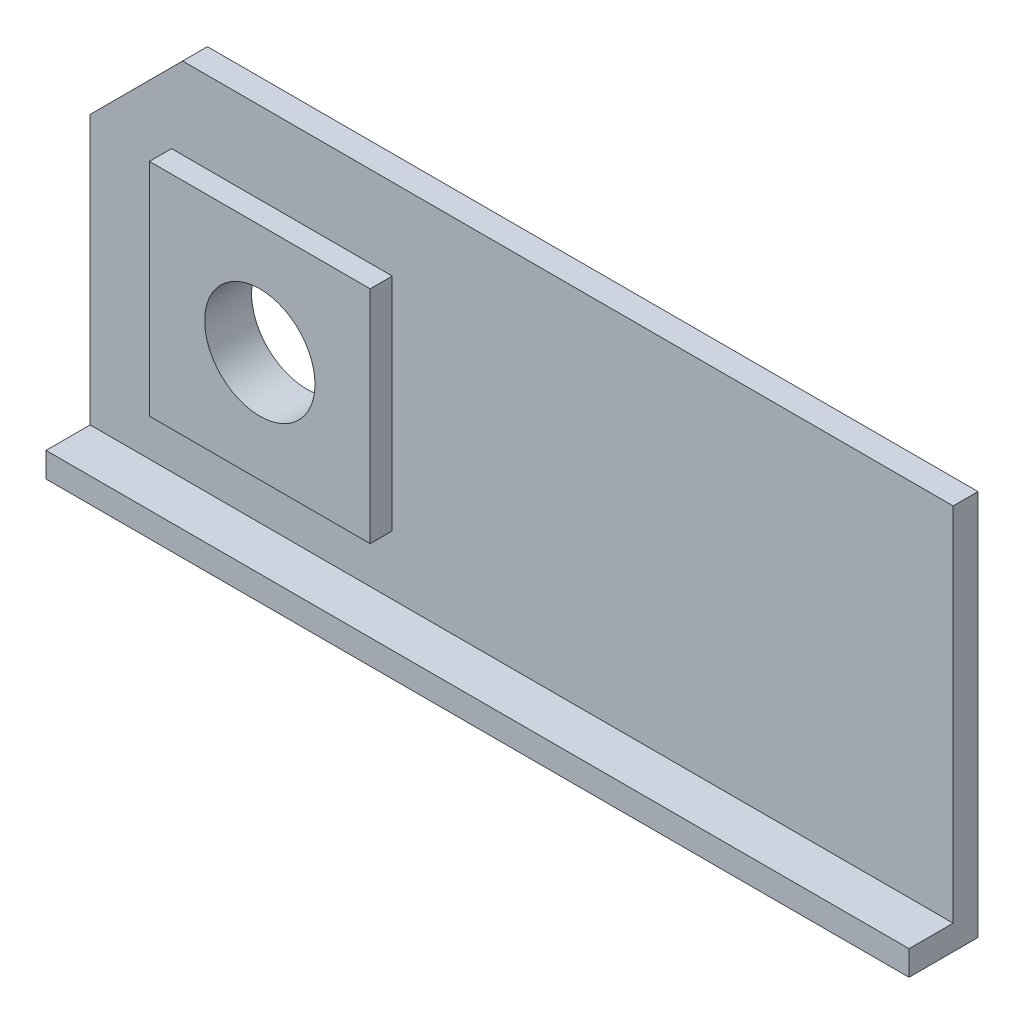
ISO-10303-21;
HEADER;
FILE_DESCRIPTION(('STEP AP214'),'2;1');
FILE_NAME('part.step','',(''),(''),'','','');
FILE_SCHEMA(('AUTOMOTIVE_DESIGN { 1 0 10303 214 1 1 1 1 }'));
ENDSEC;
DATA;
#1=APPLICATION_CONTEXT('core data for automotive mechanical design processes');
#2=APPLICATION_PROTOCOL_DEFINITION('international standard','automotive_design',2000,#1);
#3=PRODUCT_CONTEXT('',#1,'mechanical');
#4=PRODUCT('Part','Part','',(#3));
#5=PRODUCT_RELATED_PRODUCT_CATEGORY('part','',(#4));
#6=PRODUCT_DEFINITION_FORMATION('','',#4);
#7=PRODUCT_DEFINITION_CONTEXT('part definition',#1,'design');
#8=PRODUCT_DEFINITION('design','',#6,#7);
#9=PRODUCT_DEFINITION_SHAPE('','',#8);
#10=(LENGTH_UNIT() NAMED_UNIT(*) SI_UNIT(.MILLI.,.METRE.));
#11=(NAMED_UNIT(*) PLANE_ANGLE_UNIT() SI_UNIT($,.RADIAN.));
#12=(NAMED_UNIT(*) SI_UNIT($,.STERADIAN.) SOLID_ANGLE_UNIT());
#13=UNCERTAINTY_MEASURE_WITH_UNIT(LENGTH_MEASURE(1.E-05),#10,'distance_accuracy_value','');
#14=(GEOMETRIC_REPRESENTATION_CONTEXT(3) GLOBAL_UNCERTAINTY_ASSIGNED_CONTEXT((#13)) GLOBAL_UNIT_ASSIGNED_CONTEXT((#10,
#11,#12)) REPRESENTATION_CONTEXT('',''));
#15=CARTESIAN_POINT('',(0.,0.,0.));
#16=DIRECTION('',(0.,0.,1.));
#17=DIRECTION('',(1.,0.,0.));
#18=AXIS2_PLACEMENT_3D('',#15,#16,#17);
#19=CARTESIAN_POINT('',(0.,0.,4.5));
#20=DIRECTION('',(0.,0.,1.));
#21=DIRECTION('',(1.,0.,0.));
#22=AXIS2_PLACEMENT_3D('',#19,#20,#21);
#23=PLANE('',#22);
#24=DIRECTION('',(-1.,0.,0.));
#25=VECTOR('',#24,1.);
#26=CARTESIAN_POINT('',(0.,-28.8754339476876,4.5));
#27=LINE('',#26,#25);
#28=CARTESIAN_POINT('',(-6.75864695548756,-28.8754339476876,4.5));
#29=VERTEX_POINT('',#28);
#30=CARTESIAN_POINT('',(-163.18445936999,-28.8754339476876,4.5));
#31=VERTEX_POINT('',#30);
#32=EDGE_CURVE('E87',#29,#31,#27,.T.);
#33=ORIENTED_EDGE('',*,*,#32,.F.);
#34=DIRECTION('',(0.,1.,0.));
#35=VECTOR('',#34,1.);
#36=CARTESIAN_POINT('',(-6.75864695548756,0.,4.5));
#37=LINE('',#36,#35);
#38=CARTESIAN_POINT('',(-6.75864695548756,36.6245660523124,4.5));
#39=VERTEX_POINT('',#38);
#40=EDGE_CURVE('E113',#29,#39,#37,.T.);
#41=ORIENTED_EDGE('',*,*,#40,.T.);
#42=DIRECTION('',(-1.,0.,0.));
#43=VECTOR('',#42,1.);
#44=CARTESIAN_POINT('',(0.,36.6245660523124,4.5));
#45=LINE('',#44,#43);
#46=CARTESIAN_POINT('',(-146.427679381491,36.6245660523124,4.5));
#47=VERTEX_POINT('',#46);
#48=EDGE_CURVE('E106',#39,#47,#45,.T.);
#49=ORIENTED_EDGE('',*,*,#48,.T.);
#50=DIRECTION('',(-0.707106781186546,-0.707106781186549,0.));
#51=VECTOR('',#50,1.);
#52=CARTESIAN_POINT('',(-91.5261227169018,91.5261227169015,4.5));
#53=LINE('',#52,#51);
#54=CARTESIAN_POINT('',(-163.18445936999,19.8677860638126,4.5));
#55=VERTEX_POINT('',#54);
#56=EDGE_CURVE('E104',#47,#55,#53,.T.);
#57=ORIENTED_EDGE('',*,*,#56,.T.);
#58=DIRECTION('',(0.,-1.,0.));
#59=VECTOR('',#58,1.);
#60=CARTESIAN_POINT('',(-163.18445936999,0.,4.5));
#61=LINE('',#60,#59);
#62=EDGE_CURVE('E62',#55,#31,#61,.T.);
#63=ORIENTED_EDGE('',*,*,#62,.T.);
#64=EDGE_LOOP('',(#33,#41,#49,#57,#63));
#65=FACE_BOUND('',#64,.T.);
#66=DIRECTION('',(0.,1.,0.));
#67=VECTOR('',#66,1.);
#68=CARTESIAN_POINT('',(-108.427679381491,21.8677860638127,4.5));
#69=LINE('',#68,#67);
#70=CARTESIAN_POINT('',(-108.427679381491,-18.1322139361873,4.5));
#71=VERTEX_POINT('',#70);
#72=CARTESIAN_POINT('',(-108.427679381491,21.8677860638127,4.5));
#73=VERTEX_POINT('',#72);
#74=EDGE_CURVE('E158',#71,#73,#69,.T.);
#75=ORIENTED_EDGE('',*,*,#74,.F.);
#76=DIRECTION('',(1.,0.,0.));
#77=VECTOR('',#76,1.);
#78=CARTESIAN_POINT('',(-108.427679381491,-18.1322139361873,4.5));
#79=LINE('',#78,#77);
#80=CARTESIAN_POINT('',(-148.427679381491,-18.1322139361873,4.5));
#81=VERTEX_POINT('',#80);
#82=EDGE_CURVE('E161',#81,#71,#79,.T.);
#83=ORIENTED_EDGE('',*,*,#82,.F.);
#84=DIRECTION('',(0.,-1.,0.));
#85=VECTOR('',#84,1.);
#86=CARTESIAN_POINT('',(-148.427679381491,-18.1322139361873,4.5));
#87=LINE('',#86,#85);
#88=CARTESIAN_POINT('',(-148.427679381491,21.8677860638127,4.5));
#89=VERTEX_POINT('',#88);
#90=EDGE_CURVE('E153',#89,#81,#87,.T.);
#91=ORIENTED_EDGE('',*,*,#90,.F.);
#92=DIRECTION('',(-1.,0.,0.));
#93=VECTOR('',#92,1.);
#94=CARTESIAN_POINT('',(-148.427679381491,21.8677860638127,4.5));
#95=LINE('',#94,#93);
#96=EDGE_CURVE('E156',#73,#89,#95,.T.);
#97=ORIENTED_EDGE('',*,*,#96,.F.);
#98=EDGE_LOOP('',(#75,#83,#91,#97));
#99=FACE_BOUND('',#98,.T.);
#100=ADVANCED_FACE('F38',(#65,#99),#23,.T.);
#101=CARTESIAN_POINT('',(0.,36.6245660523124,4.5));
#102=DIRECTION('',(0.,-1.,0.));
#103=DIRECTION('',(0.,0.,-1.));
#104=AXIS2_PLACEMENT_3D('',#101,#102,#103);
#105=PLANE('',#104);
#106=DIRECTION('',(-1.,0.,0.));
#107=VECTOR('',#106,1.);
#108=CARTESIAN_POINT('',(0.,36.6245660523124,0.));
#109=LINE('',#108,#107);
#110=CARTESIAN_POINT('',(-6.75864695548756,36.6245660523124,0.));
#111=VERTEX_POINT('',#110);
#112=CARTESIAN_POINT('',(-146.427679381491,36.6245660523124,0.));
#113=VERTEX_POINT('',#112);
#114=EDGE_CURVE('E95',#111,#113,#109,.T.);
#115=ORIENTED_EDGE('',*,*,#114,.T.);
#116=DIRECTION('',(0.,0.,-1.));
#117=VECTOR('',#116,1.);
#118=CARTESIAN_POINT('',(-146.427679381491,36.6245660523124,4.5));
#119=LINE('',#118,#117);
#120=EDGE_CURVE('E11',#47,#113,#119,.T.);
#121=ORIENTED_EDGE('',*,*,#120,.F.);
#122=ORIENTED_EDGE('',*,*,#48,.F.);
#123=DIRECTION('',(0.,0.,-1.));
#124=VECTOR('',#123,1.);
#125=CARTESIAN_POINT('',(-6.75864695548756,36.6245660523124,4.5));
#126=LINE('',#125,#124);
#127=EDGE_CURVE('E102',#39,#111,#126,.T.);
#128=ORIENTED_EDGE('',*,*,#127,.T.);
#129=EDGE_LOOP('',(#115,#121,#122,#128));
#130=FACE_BOUND('',#129,.T.);
#131=ADVANCED_FACE('F197',(#130),#105,.F.);
#132=CARTESIAN_POINT('',(-91.5261227169018,91.5261227169015,4.5));
#133=DIRECTION('',(0.707106781186549,-0.707106781186546,0.));
#134=DIRECTION('',(0.707106781186546,0.707106781186549,0.));
#135=AXIS2_PLACEMENT_3D('',#132,#133,#134);
#136=PLANE('',#135);
#137=DIRECTION('',(-0.707106781186546,-0.707106781186549,0.));
#138=VECTOR('',#137,1.);
#139=CARTESIAN_POINT('',(-91.5261227169018,91.5261227169015,0.));
#140=LINE('',#139,#138);
#141=CARTESIAN_POINT('',(-163.18445936999,19.8677860638126,0.));
#142=VERTEX_POINT('',#141);
#143=EDGE_CURVE('E81',#113,#142,#140,.T.);
#144=ORIENTED_EDGE('',*,*,#143,.T.);
#145=DIRECTION('',(0.,0.,-1.));
#146=VECTOR('',#145,1.);
#147=CARTESIAN_POINT('',(-163.18445936999,19.8677860638126,4.5));
#148=LINE('',#147,#146);
#149=EDGE_CURVE('E46',#55,#142,#148,.T.);
#150=ORIENTED_EDGE('',*,*,#149,.F.);
#151=ORIENTED_EDGE('',*,*,#56,.F.);
#152=ORIENTED_EDGE('',*,*,#120,.T.);
#153=EDGE_LOOP('',(#144,#150,#151,#152));
#154=FACE_BOUND('',#153,.T.);
#155=ADVANCED_FACE('F92',(#154),#136,.F.);
#156=CARTESIAN_POINT('',(-128.427679381491,1.86778606381273,4.5));
#157=DIRECTION('',(0.,0.,-1.));
#158=DIRECTION('',(-1.,0.,0.));
#159=AXIS2_PLACEMENT_3D('',#156,#157,#158);
#160=CYLINDRICAL_SURFACE('',#159,10.);
#161=CARTESIAN_POINT('',(-128.427679381491,1.86778606381273,0.));
#162=DIRECTION('',(0.,0.,1.));
#163=DIRECTION('',(1.,0.,0.));
#164=AXIS2_PLACEMENT_3D('',#161,#162,#163);
#165=CIRCLE('',#164,10.);
#166=CARTESIAN_POINT('',(-118.427679381491,1.86778606381273,0.));
#167=VERTEX_POINT('',#166);
#168=EDGE_CURVE('E97',#167,#167,#165,.T.);
#169=ORIENTED_EDGE('',*,*,#168,.F.);
#170=EDGE_LOOP('',(#169));
#171=FACE_BOUND('',#170,.T.);
#172=CARTESIAN_POINT('',(-128.427679381491,1.86778606381273,8.5));
#173=DIRECTION('',(0.,0.,1.));
#174=DIRECTION('',(1.,0.,0.));
#175=AXIS2_PLACEMENT_3D('',#172,#173,#174);
#176=CIRCLE('',#175,10.);
#177=CARTESIAN_POINT('',(-118.427679381491,1.86778606381273,8.5));
#178=VERTEX_POINT('',#177);
#179=EDGE_CURVE('E164',#178,#178,#176,.T.);
#180=ORIENTED_EDGE('',*,*,#179,.T.);
#181=EDGE_LOOP('',(#180));
#182=FACE_BOUND('',#181,.T.);
#183=ADVANCED_FACE('F40',(#171,#182),#160,.F.);
#184=CARTESIAN_POINT('',(-163.18445936999,0.,4.5));
#185=DIRECTION('',(1.,0.,0.));
#186=DIRECTION('',(0.,0.,-1.));
#187=AXIS2_PLACEMENT_3D('',#184,#185,#186);
#188=PLANE('',#187);
#189=DIRECTION('',(0.,-1.,0.));
#190=VECTOR('',#189,1.);
#191=CARTESIAN_POINT('',(-163.18445936999,0.,0.));
#192=LINE('',#191,#190);
#193=CARTESIAN_POINT('',(-163.18445936999,-33.3754339476876,0.));
#194=VERTEX_POINT('',#193);
#195=EDGE_CURVE('E76',#142,#194,#192,.T.);
#196=ORIENTED_EDGE('',*,*,#195,.T.);
#197=DIRECTION('',(0.,0.,-1.));
#198=VECTOR('',#197,1.);
#199=CARTESIAN_POINT('',(-163.18445936999,-33.3754339476876,12.5));
#200=LINE('',#199,#198);
#201=CARTESIAN_POINT('',(-163.18445936999,-33.3754339476876,12.5));
#202=VERTEX_POINT('',#201);
#203=EDGE_CURVE('E124',#202,#194,#200,.T.);
#204=ORIENTED_EDGE('',*,*,#203,.F.);
#205=DIRECTION('',(0.,-1.,0.));
#206=VECTOR('',#205,1.);
#207=CARTESIAN_POINT('',(-163.18445936999,0.,12.5));
#208=LINE('',#207,#206);
#209=CARTESIAN_POINT('',(-163.18445936999,-28.8754339476876,12.5));
#210=VERTEX_POINT('',#209);
#211=EDGE_CURVE('E135',#210,#202,#208,.T.);
#212=ORIENTED_EDGE('',*,*,#211,.F.);
#213=DIRECTION('',(0.,0.,-1.));
#214=VECTOR('',#213,1.);
#215=CARTESIAN_POINT('',(-163.18445936999,-28.8754339476876,12.5));
#216=LINE('',#215,#214);
#217=EDGE_CURVE('E122',#210,#31,#216,.T.);
#218=ORIENTED_EDGE('',*,*,#217,.T.);
#219=ORIENTED_EDGE('',*,*,#62,.F.);
#220=ORIENTED_EDGE('',*,*,#149,.T.);
#221=EDGE_LOOP('',(#196,#204,#212,#218,#219,#220));
#222=FACE_BOUND('',#221,.T.);
#223=ADVANCED_FACE('F90',(#222),#188,.F.);
#224=CARTESIAN_POINT('',(0.,0.,0.));
#225=DIRECTION('',(0.,0.,1.));
#226=DIRECTION('',(1.,0.,0.));
#227=AXIS2_PLACEMENT_3D('',#224,#225,#226);
#228=PLANE('',#227);
#229=ORIENTED_EDGE('',*,*,#168,.T.);
#230=EDGE_LOOP('',(#229));
#231=FACE_BOUND('',#230,.T.);
#232=DIRECTION('',(0.,1.,0.));
#233=VECTOR('',#232,1.);
#234=CARTESIAN_POINT('',(-6.75864695548756,0.,0.));
#235=LINE('',#234,#233);
#236=CARTESIAN_POINT('',(-6.75864695548756,-33.3754339476876,0.));
#237=VERTEX_POINT('',#236);
#238=EDGE_CURVE('E114',#237,#111,#235,.T.);
#239=ORIENTED_EDGE('',*,*,#238,.F.);
#240=DIRECTION('',(1.,0.,0.));
#241=VECTOR('',#240,1.);
#242=CARTESIAN_POINT('',(0.,-33.3754339476876,0.));
#243=LINE('',#242,#241);
#244=EDGE_CURVE('E84',#194,#237,#243,.T.);
#245=ORIENTED_EDGE('',*,*,#244,.F.);
#246=ORIENTED_EDGE('',*,*,#195,.F.);
#247=ORIENTED_EDGE('',*,*,#143,.F.);
#248=ORIENTED_EDGE('',*,*,#114,.F.);
#249=EDGE_LOOP('',(#239,#245,#246,#247,#248));
#250=FACE_BOUND('',#249,.T.);
#251=ADVANCED_FACE('F78',(#231,#250),#228,.F.);
#252=CARTESIAN_POINT('',(-6.75864695548756,0.,4.5));
#253=DIRECTION('',(-1.,0.,0.));
#254=DIRECTION('',(0.,0.,1.));
#255=AXIS2_PLACEMENT_3D('',#252,#253,#254);
#256=PLANE('',#255);
#257=ORIENTED_EDGE('',*,*,#238,.T.);
#258=ORIENTED_EDGE('',*,*,#127,.F.);
#259=ORIENTED_EDGE('',*,*,#40,.F.);
#260=DIRECTION('',(0.,0.,-1.));
#261=VECTOR('',#260,1.);
#262=CARTESIAN_POINT('',(-6.75864695548756,-28.8754339476876,12.5));
#263=LINE('',#262,#261);
#264=CARTESIAN_POINT('',(-6.75864695548756,-28.8754339476876,12.5));
#265=VERTEX_POINT('',#264);
#266=EDGE_CURVE('E117',#265,#29,#263,.T.);
#267=ORIENTED_EDGE('',*,*,#266,.F.);
#268=DIRECTION('',(0.,1.,0.));
#269=VECTOR('',#268,1.);
#270=CARTESIAN_POINT('',(-6.75864695548756,0.,12.5));
#271=LINE('',#270,#269);
#272=CARTESIAN_POINT('',(-6.75864695548756,-33.3754339476876,12.5));
#273=VERTEX_POINT('',#272);
#274=EDGE_CURVE('E131',#273,#265,#271,.T.);
#275=ORIENTED_EDGE('',*,*,#274,.F.);
#276=DIRECTION('',(0.,0.,-1.));
#277=VECTOR('',#276,1.);
#278=CARTESIAN_POINT('',(-6.75864695548756,-33.3754339476876,12.5));
#279=LINE('',#278,#277);
#280=EDGE_CURVE('E126',#273,#237,#279,.T.);
#281=ORIENTED_EDGE('',*,*,#280,.T.);
#282=EDGE_LOOP('',(#257,#258,#259,#267,#275,#281));
#283=FACE_BOUND('',#282,.T.);
#284=ADVANCED_FACE('F208',(#283),#256,.F.);
#285=CARTESIAN_POINT('',(0.,-28.8754339476876,12.5));
#286=DIRECTION('',(0.,-1.,0.));
#287=DIRECTION('',(0.,0.,-1.));
#288=AXIS2_PLACEMENT_3D('',#285,#286,#287);
#289=PLANE('',#288);
#290=ORIENTED_EDGE('',*,*,#266,.T.);
#291=ORIENTED_EDGE('',*,*,#32,.T.);
#292=ORIENTED_EDGE('',*,*,#217,.F.);
#293=DIRECTION('',(-1.,0.,0.));
#294=VECTOR('',#293,1.);
#295=CARTESIAN_POINT('',(0.,-28.8754339476876,12.5));
#296=LINE('',#295,#294);
#297=EDGE_CURVE('E138',#265,#210,#296,.T.);
#298=ORIENTED_EDGE('',*,*,#297,.F.);
#299=EDGE_LOOP('',(#290,#291,#292,#298));
#300=FACE_BOUND('',#299,.T.);
#301=ADVANCED_FACE('F238',(#300),#289,.F.);
#302=CARTESIAN_POINT('',(0.,-33.3754339476876,12.5));
#303=DIRECTION('',(0.,1.,0.));
#304=DIRECTION('',(-1.,0.,0.));
#305=AXIS2_PLACEMENT_3D('',#302,#303,#304);
#306=PLANE('',#305);
#307=ORIENTED_EDGE('',*,*,#244,.T.);
#308=ORIENTED_EDGE('',*,*,#280,.F.);
#309=DIRECTION('',(1.,0.,0.));
#310=VECTOR('',#309,1.);
#311=CARTESIAN_POINT('',(0.,-33.3754339476876,12.5));
#312=LINE('',#311,#310);
#313=EDGE_CURVE('E129',#202,#273,#312,.T.);
#314=ORIENTED_EDGE('',*,*,#313,.F.);
#315=ORIENTED_EDGE('',*,*,#203,.T.);
#316=EDGE_LOOP('',(#307,#308,#314,#315));
#317=FACE_BOUND('',#316,.T.);
#318=ADVANCED_FACE('F192',(#317),#306,.F.);
#319=CARTESIAN_POINT('',(0.,0.,12.5));
#320=DIRECTION('',(0.,0.,1.));
#321=DIRECTION('',(1.,0.,0.));
#322=AXIS2_PLACEMENT_3D('',#319,#320,#321);
#323=PLANE('',#322);
#324=ORIENTED_EDGE('',*,*,#274,.T.);
#325=ORIENTED_EDGE('',*,*,#297,.T.);
#326=ORIENTED_EDGE('',*,*,#211,.T.);
#327=ORIENTED_EDGE('',*,*,#313,.T.);
#328=EDGE_LOOP('',(#324,#325,#326,#327));
#329=FACE_BOUND('',#328,.T.);
#330=ADVANCED_FACE('F182',(#329),#323,.T.);
#331=CARTESIAN_POINT('',(0.,0.,8.5));
#332=DIRECTION('',(0.,0.,-1.));
#333=DIRECTION('',(-1.,0.,0.));
#334=AXIS2_PLACEMENT_3D('',#331,#332,#333);
#335=PLANE('',#334);
#336=DIRECTION('',(1.,0.,0.));
#337=VECTOR('',#336,1.);
#338=CARTESIAN_POINT('',(-108.427679381491,-18.1322139361873,8.5));
#339=LINE('',#338,#337);
#340=CARTESIAN_POINT('',(-148.427679381491,-18.1322139361873,8.5));
#341=VERTEX_POINT('',#340);
#342=CARTESIAN_POINT('',(-108.427679381491,-18.1322139361873,8.5));
#343=VERTEX_POINT('',#342);
#344=EDGE_CURVE('E155',#341,#343,#339,.T.);
#345=ORIENTED_EDGE('',*,*,#344,.T.);
#346=DIRECTION('',(0.,1.,0.));
#347=VECTOR('',#346,1.);
#348=CARTESIAN_POINT('',(-108.427679381491,21.8677860638127,8.5));
#349=LINE('',#348,#347);
#350=CARTESIAN_POINT('',(-108.427679381491,21.8677860638127,8.5));
#351=VERTEX_POINT('',#350);
#352=EDGE_CURVE('E170',#343,#351,#349,.T.);
#353=ORIENTED_EDGE('',*,*,#352,.T.);
#354=DIRECTION('',(-1.,0.,0.));
#355=VECTOR('',#354,1.);
#356=CARTESIAN_POINT('',(-148.427679381491,21.8677860638127,8.5));
#357=LINE('',#356,#355);
#358=CARTESIAN_POINT('',(-148.427679381491,21.8677860638127,8.5));
#359=VERTEX_POINT('',#358);
#360=EDGE_CURVE('E167',#351,#359,#357,.T.);
#361=ORIENTED_EDGE('',*,*,#360,.T.);
#362=DIRECTION('',(0.,-1.,0.));
#363=VECTOR('',#362,1.);
#364=CARTESIAN_POINT('',(-148.427679381491,-18.1322139361873,8.5));
#365=LINE('',#364,#363);
#366=EDGE_CURVE('E152',#359,#341,#365,.T.);
#367=ORIENTED_EDGE('',*,*,#366,.T.);
#368=EDGE_LOOP('',(#345,#353,#361,#367));
#369=FACE_BOUND('',#368,.T.);
#370=ORIENTED_EDGE('',*,*,#179,.F.);
#371=EDGE_LOOP('',(#370));
#372=FACE_BOUND('',#371,.T.);
#373=ADVANCED_FACE('F179',(#369,#372),#335,.F.);
#374=CARTESIAN_POINT('',(-108.427679381491,-18.1322139361873,8.5));
#375=DIRECTION('',(0.,1.,0.));
#376=DIRECTION('',(-1.,0.,0.));
#377=AXIS2_PLACEMENT_3D('',#374,#375,#376);
#378=PLANE('',#377);
#379=ORIENTED_EDGE('',*,*,#82,.T.);
#380=DIRECTION('',(0.,0.,-1.));
#381=VECTOR('',#380,1.);
#382=CARTESIAN_POINT('',(-108.427679381491,-18.1322139361873,8.5));
#383=LINE('',#382,#381);
#384=EDGE_CURVE('E132',#343,#71,#383,.T.);
#385=ORIENTED_EDGE('',*,*,#384,.F.);
#386=ORIENTED_EDGE('',*,*,#344,.F.);
#387=DIRECTION('',(0.,0.,-1.));
#388=VECTOR('',#387,1.);
#389=CARTESIAN_POINT('',(-148.427679381491,-18.1322139361873,8.5));
#390=LINE('',#389,#388);
#391=EDGE_CURVE('E149',#341,#81,#390,.T.);
#392=ORIENTED_EDGE('',*,*,#391,.T.);
#393=EDGE_LOOP('',(#379,#385,#386,#392));
#394=FACE_BOUND('',#393,.T.);
#395=ADVANCED_FACE('F181',(#394),#378,.F.);
#396=CARTESIAN_POINT('',(-108.427679381491,21.8677860638127,8.5));
#397=DIRECTION('',(-1.,0.,0.));
#398=DIRECTION('',(0.,0.,1.));
#399=AXIS2_PLACEMENT_3D('',#396,#397,#398);
#400=PLANE('',#399);
#401=ORIENTED_EDGE('',*,*,#74,.T.);
#402=DIRECTION('',(0.,0.,-1.));
#403=VECTOR('',#402,1.);
#404=CARTESIAN_POINT('',(-108.427679381491,21.8677860638127,8.5));
#405=LINE('',#404,#403);
#406=EDGE_CURVE('E145',#351,#73,#405,.T.);
#407=ORIENTED_EDGE('',*,*,#406,.F.);
#408=ORIENTED_EDGE('',*,*,#352,.F.);
#409=ORIENTED_EDGE('',*,*,#384,.T.);
#410=EDGE_LOOP('',(#401,#407,#408,#409));
#411=FACE_BOUND('',#410,.T.);
#412=ADVANCED_FACE('F189',(#411),#400,.F.);
#413=CARTESIAN_POINT('',(-148.427679381491,21.8677860638127,8.5));
#414=DIRECTION('',(0.,-1.,0.));
#415=DIRECTION('',(0.,0.,-1.));
#416=AXIS2_PLACEMENT_3D('',#413,#414,#415);
#417=PLANE('',#416);
#418=ORIENTED_EDGE('',*,*,#96,.T.);
#419=DIRECTION('',(0.,0.,-1.));
#420=VECTOR('',#419,1.);
#421=CARTESIAN_POINT('',(-148.427679381491,21.8677860638127,8.5));
#422=LINE('',#421,#420);
#423=EDGE_CURVE('E53',#359,#89,#422,.T.);
#424=ORIENTED_EDGE('',*,*,#423,.F.);
#425=ORIENTED_EDGE('',*,*,#360,.F.);
#426=ORIENTED_EDGE('',*,*,#406,.T.);
#427=EDGE_LOOP('',(#418,#424,#425,#426));
#428=FACE_BOUND('',#427,.T.);
#429=ADVANCED_FACE('F289',(#428),#417,.F.);
#430=CARTESIAN_POINT('',(-148.427679381491,-18.1322139361873,8.5));
#431=DIRECTION('',(1.,0.,0.));
#432=DIRECTION('',(0.,0.,-1.));
#433=AXIS2_PLACEMENT_3D('',#430,#431,#432);
#434=PLANE('',#433);
#435=ORIENTED_EDGE('',*,*,#90,.T.);
#436=ORIENTED_EDGE('',*,*,#391,.F.);
#437=ORIENTED_EDGE('',*,*,#366,.F.);
#438=ORIENTED_EDGE('',*,*,#423,.T.);
#439=EDGE_LOOP('',(#435,#436,#437,#438));
#440=FACE_BOUND('',#439,.T.);
#441=ADVANCED_FACE('F298',(#440),#434,.F.);
#442=CLOSED_SHELL('',(#100,#131,#155,#183,#223,#251,#284,#301,#318,#330,#373,#395,#412,#429,#441));
#443=MANIFOLD_SOLID_BREP('B2',#442);
#444=ADVANCED_BREP_SHAPE_REPRESENTATION('',(#18,#443),#14);
#445=SHAPE_DEFINITION_REPRESENTATION(#9,#444);
ENDSEC;
END-ISO-10303-21;
